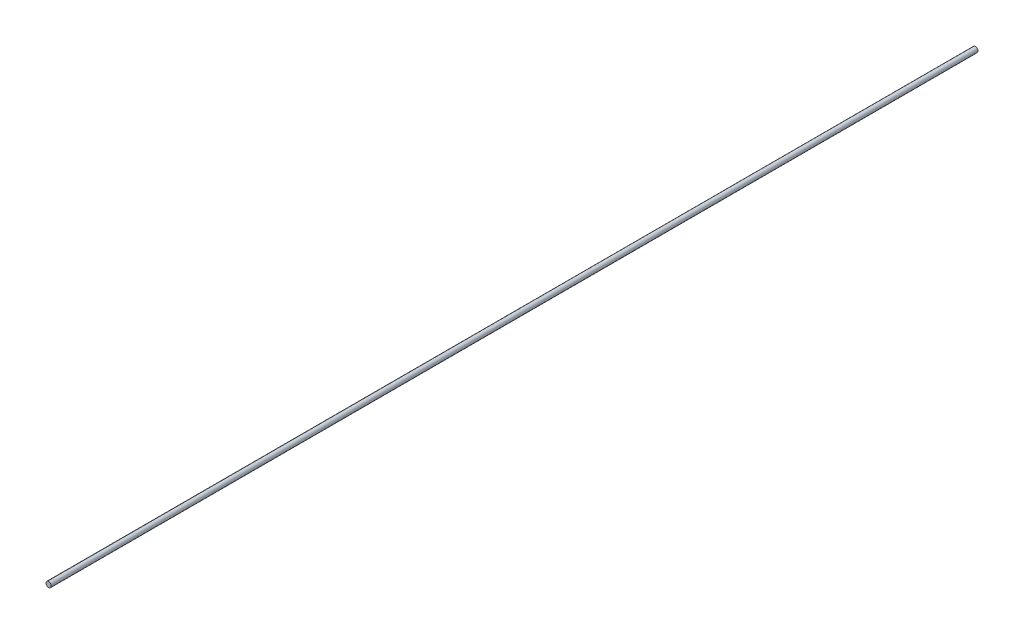
ISO-10303-21;
HEADER;
FILE_DESCRIPTION(('STEP AP214'),'2;1');
FILE_NAME('part.step','',(''),(''),'','','');
FILE_SCHEMA(('AUTOMOTIVE_DESIGN { 1 0 10303 214 1 1 1 1 }'));
ENDSEC;
DATA;
#1=APPLICATION_CONTEXT('core data for automotive mechanical design processes');
#2=APPLICATION_PROTOCOL_DEFINITION('international standard','automotive_design',2000,#1);
#3=PRODUCT_CONTEXT('',#1,'mechanical');
#4=PRODUCT('Part','Part','',(#3));
#5=PRODUCT_RELATED_PRODUCT_CATEGORY('part','',(#4));
#6=PRODUCT_DEFINITION_FORMATION('','',#4);
#7=PRODUCT_DEFINITION_CONTEXT('part definition',#1,'design');
#8=PRODUCT_DEFINITION('design','',#6,#7);
#9=PRODUCT_DEFINITION_SHAPE('','',#8);
#10=(LENGTH_UNIT() NAMED_UNIT(*) SI_UNIT(.MILLI.,.METRE.));
#11=(NAMED_UNIT(*) PLANE_ANGLE_UNIT() SI_UNIT($,.RADIAN.));
#12=(NAMED_UNIT(*) SI_UNIT($,.STERADIAN.) SOLID_ANGLE_UNIT());
#13=UNCERTAINTY_MEASURE_WITH_UNIT(LENGTH_MEASURE(1.E-05),#10,'distance_accuracy_value','');
#14=(GEOMETRIC_REPRESENTATION_CONTEXT(3) GLOBAL_UNCERTAINTY_ASSIGNED_CONTEXT((#13)) GLOBAL_UNIT_ASSIGNED_CONTEXT((#10,
#11,#12)) REPRESENTATION_CONTEXT('',''));
#15=CARTESIAN_POINT('',(0.,0.,0.));
#16=DIRECTION('',(0.,0.,1.));
#17=DIRECTION('',(1.,0.,0.));
#18=AXIS2_PLACEMENT_3D('',#15,#16,#17);
#19=CARTESIAN_POINT('',(0.,0.,4488.434));
#20=DIRECTION('',(0.,0.,-1.));
#21=DIRECTION('',(-1.,0.,0.));
#22=AXIS2_PLACEMENT_3D('',#19,#20,#21);
#23=CYLINDRICAL_SURFACE('',#22,12.7);
#24=CARTESIAN_POINT('',(0.,0.,4488.434));
#25=DIRECTION('',(0.,0.,1.));
#26=DIRECTION('',(1.,0.,0.));
#27=AXIS2_PLACEMENT_3D('',#24,#25,#26);
#28=CIRCLE('',#27,12.7);
#29=CARTESIAN_POINT('',(12.7,0.,4488.434));
#30=VERTEX_POINT('',#29);
#31=EDGE_CURVE('E10',#30,#30,#28,.T.);
#32=ORIENTED_EDGE('',*,*,#31,.F.);
#33=EDGE_LOOP('',(#32));
#34=FACE_BOUND('',#33,.T.);
#35=CARTESIAN_POINT('',(0.,0.,0.));
#36=DIRECTION('',(0.,0.,1.));
#37=DIRECTION('',(1.,0.,0.));
#38=AXIS2_PLACEMENT_3D('',#35,#36,#37);
#39=CIRCLE('',#38,12.7);
#40=CARTESIAN_POINT('',(12.7,0.,0.));
#41=VERTEX_POINT('',#40);
#42=EDGE_CURVE('E46',#41,#41,#39,.T.);
#43=ORIENTED_EDGE('',*,*,#42,.T.);
#44=EDGE_LOOP('',(#43));
#45=FACE_BOUND('',#44,.T.);
#46=ADVANCED_FACE('F43',(#34,#45),#23,.T.);
#47=CARTESIAN_POINT('',(0.,0.,4488.434));
#48=DIRECTION('',(0.,0.,1.));
#49=DIRECTION('',(1.,0.,0.));
#50=AXIS2_PLACEMENT_3D('',#47,#48,#49);
#51=PLANE('',#50);
#52=ORIENTED_EDGE('',*,*,#31,.T.);
#53=EDGE_LOOP('',(#52));
#54=FACE_BOUND('',#53,.T.);
#55=ADVANCED_FACE('F59',(#54),#51,.T.);
#56=CARTESIAN_POINT('',(0.,0.,0.));
#57=DIRECTION('',(0.,0.,1.));
#58=DIRECTION('',(1.,0.,0.));
#59=AXIS2_PLACEMENT_3D('',#56,#57,#58);
#60=PLANE('',#59);
#61=ORIENTED_EDGE('',*,*,#42,.F.);
#62=EDGE_LOOP('',(#61));
#63=FACE_BOUND('',#62,.T.);
#64=ADVANCED_FACE('F57',(#63),#60,.F.);
#65=CLOSED_SHELL('',(#46,#55,#64));
#66=MANIFOLD_SOLID_BREP('B2',#65);
#67=ADVANCED_BREP_SHAPE_REPRESENTATION('',(#18,#66),#14);
#68=SHAPE_DEFINITION_REPRESENTATION(#9,#67);
ENDSEC;
END-ISO-10303-21;
